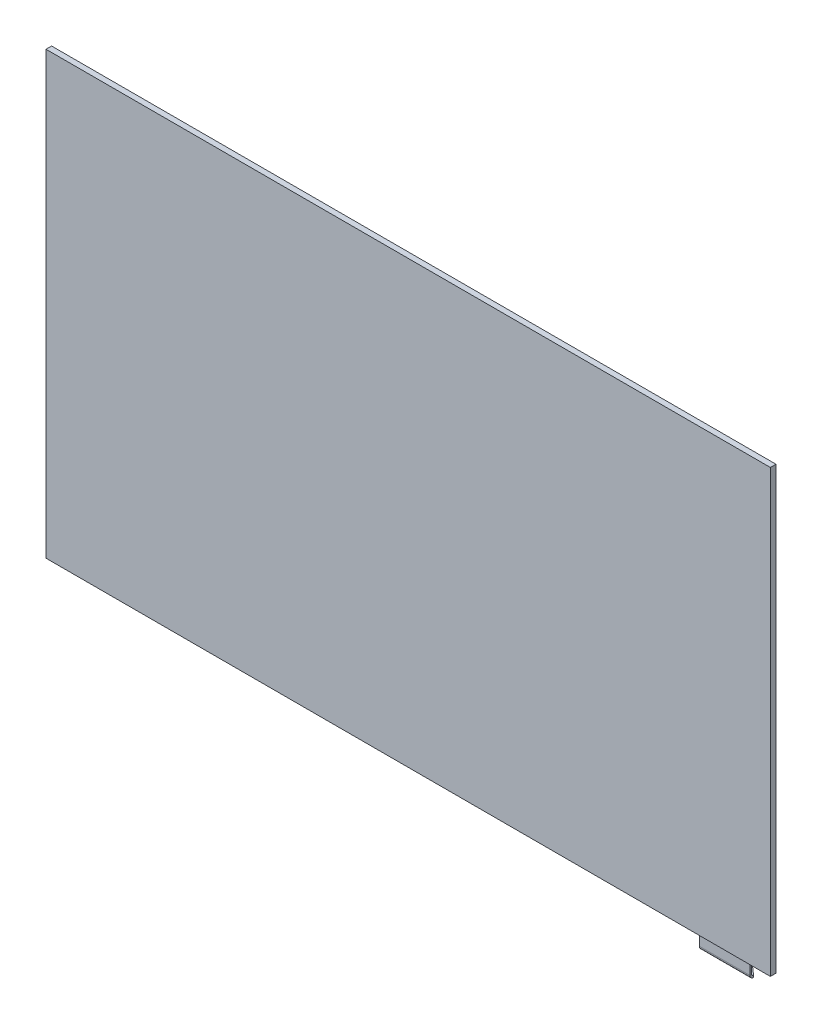
ISO-10303-21;
HEADER;
FILE_DESCRIPTION(('STEP AP214'),'2;1');
FILE_NAME('part.step','',(''),(''),'','','');
FILE_SCHEMA(('AUTOMOTIVE_DESIGN { 1 0 10303 214 1 1 1 1 }'));
ENDSEC;
DATA;
#1=APPLICATION_CONTEXT('core data for automotive mechanical design processes');
#2=APPLICATION_PROTOCOL_DEFINITION('international standard','automotive_design',2000,#1);
#3=PRODUCT_CONTEXT('',#1,'mechanical');
#4=PRODUCT('Part','Part','',(#3));
#5=PRODUCT_RELATED_PRODUCT_CATEGORY('part','',(#4));
#6=PRODUCT_DEFINITION_FORMATION('','',#4);
#7=PRODUCT_DEFINITION_CONTEXT('part definition',#1,'design');
#8=PRODUCT_DEFINITION('design','',#6,#7);
#9=PRODUCT_DEFINITION_SHAPE('','',#8);
#10=(LENGTH_UNIT() NAMED_UNIT(*) SI_UNIT(.MILLI.,.METRE.));
#11=(NAMED_UNIT(*) PLANE_ANGLE_UNIT() SI_UNIT($,.RADIAN.));
#12=(NAMED_UNIT(*) SI_UNIT($,.STERADIAN.) SOLID_ANGLE_UNIT());
#13=UNCERTAINTY_MEASURE_WITH_UNIT(LENGTH_MEASURE(1.E-05),#10,'distance_accuracy_value','');
#14=(GEOMETRIC_REPRESENTATION_CONTEXT(3) GLOBAL_UNCERTAINTY_ASSIGNED_CONTEXT((#13)) GLOBAL_UNIT_ASSIGNED_CONTEXT((#10,
#11,#12)) REPRESENTATION_CONTEXT('',''));
#15=CARTESIAN_POINT('',(0.,0.,0.));
#16=DIRECTION('',(0.,0.,1.));
#17=DIRECTION('',(1.,0.,0.));
#18=AXIS2_PLACEMENT_3D('',#15,#16,#17);
#19=CARTESIAN_POINT('',(-102.39375,-62.309375,1.5875));
#20=DIRECTION('',(0.,1.,0.));
#21=DIRECTION('',(0.,0.,1.));
#22=AXIS2_PLACEMENT_3D('',#19,#20,#21);
#23=PLANE('',#22);
#24=DIRECTION('',(1.,0.,0.));
#25=VECTOR('',#24,1.);
#26=CARTESIAN_POINT('',(-102.39375,-62.309375,0.));
#27=LINE('',#26,#25);
#28=CARTESIAN_POINT('',(-102.39375,-62.309375,0.));
#29=VERTEX_POINT('',#28);
#30=CARTESIAN_POINT('',(102.39375,-62.309375,0.));
#31=VERTEX_POINT('',#30);
#32=EDGE_CURVE('E77',#29,#31,#27,.T.);
#33=ORIENTED_EDGE('',*,*,#32,.T.);
#34=DIRECTION('',(0.,0.,-1.));
#35=VECTOR('',#34,1.);
#36=CARTESIAN_POINT('',(102.39375,-62.309375,1.5875));
#37=LINE('',#36,#35);
#38=CARTESIAN_POINT('',(102.39375,-62.309375,1.5875));
#39=VERTEX_POINT('',#38);
#40=EDGE_CURVE('E226',#39,#31,#37,.T.);
#41=ORIENTED_EDGE('',*,*,#40,.F.);
#42=DIRECTION('',(1.,0.,0.));
#43=VECTOR('',#42,1.);
#44=CARTESIAN_POINT('',(-102.39375,-62.309375,1.5875));
#45=LINE('',#44,#43);
#46=CARTESIAN_POINT('',(-102.39375,-62.309375,1.5875));
#47=VERTEX_POINT('',#46);
#48=EDGE_CURVE('E56',#47,#39,#45,.T.);
#49=ORIENTED_EDGE('',*,*,#48,.F.);
#50=DIRECTION('',(0.,0.,-1.));
#51=VECTOR('',#50,1.);
#52=CARTESIAN_POINT('',(-102.39375,-62.309375,1.5875));
#53=LINE('',#52,#51);
#54=EDGE_CURVE('E235',#47,#29,#53,.T.);
#55=ORIENTED_EDGE('',*,*,#54,.T.);
#56=EDGE_LOOP('',(#33,#41,#49,#55));
#57=FACE_BOUND('',#56,.T.);
#58=DIRECTION('',(0.,0.,-1.));
#59=VECTOR('',#58,1.);
#60=CARTESIAN_POINT('',(81.75625,-62.309375,1.04775));
#61=LINE('',#60,#59);
#62=CARTESIAN_POINT('',(81.75625,-62.309375,1.04775));
#63=VERTEX_POINT('',#62);
#64=CARTESIAN_POINT('',(81.75625,-62.309375,0.53975));
#65=VERTEX_POINT('',#64);
#66=EDGE_CURVE('E287',#63,#65,#61,.T.);
#67=ORIENTED_EDGE('',*,*,#66,.F.);
#68=DIRECTION('',(1.,0.,0.));
#69=VECTOR('',#68,1.);
#70=CARTESIAN_POINT('',(81.75625,-62.309375,1.04775));
#71=LINE('',#70,#69);
#72=CARTESIAN_POINT('',(96.04375,-62.309375,1.04775));
#73=VERTEX_POINT('',#72);
#74=EDGE_CURVE('E196',#63,#73,#71,.T.);
#75=ORIENTED_EDGE('',*,*,#74,.T.);
#76=DIRECTION('',(0.,0.,-1.));
#77=VECTOR('',#76,1.);
#78=CARTESIAN_POINT('',(96.04375,-62.309375,1.04775));
#79=LINE('',#78,#77);
#80=CARTESIAN_POINT('',(96.04375,-62.309375,0.539749999999995));
#81=VERTEX_POINT('',#80);
#82=EDGE_CURVE('E297',#73,#81,#79,.T.);
#83=ORIENTED_EDGE('',*,*,#82,.T.);
#84=DIRECTION('',(1.,0.,0.));
#85=VECTOR('',#84,1.);
#86=CARTESIAN_POINT('',(81.75625,-62.309375,0.53975));
#87=LINE('',#86,#85);
#88=EDGE_CURVE('E199',#65,#81,#87,.T.);
#89=ORIENTED_EDGE('',*,*,#88,.F.);
#90=EDGE_LOOP('',(#67,#75,#83,#89));
#91=FACE_BOUND('',#90,.T.);
#92=ADVANCED_FACE('F32',(#57,#91),#23,.F.);
#93=CARTESIAN_POINT('',(102.39375,-62.309375,1.5875));
#94=DIRECTION('',(-1.,0.,0.));
#95=DIRECTION('',(0.,0.,1.));
#96=AXIS2_PLACEMENT_3D('',#93,#94,#95);
#97=PLANE('',#96);
#98=DIRECTION('',(0.,1.,0.));
#99=VECTOR('',#98,1.);
#100=CARTESIAN_POINT('',(102.39375,-62.309375,0.));
#101=LINE('',#100,#99);
#102=CARTESIAN_POINT('',(102.39375,62.309375,0.));
#103=VERTEX_POINT('',#102);
#104=EDGE_CURVE('E189',#31,#103,#101,.T.);
#105=ORIENTED_EDGE('',*,*,#104,.T.);
#106=DIRECTION('',(0.,0.,-1.));
#107=VECTOR('',#106,1.);
#108=CARTESIAN_POINT('',(102.39375,62.309375,1.5875));
#109=LINE('',#108,#107);
#110=CARTESIAN_POINT('',(102.39375,62.309375,1.5875));
#111=VERTEX_POINT('',#110);
#112=EDGE_CURVE('E240',#111,#103,#109,.T.);
#113=ORIENTED_EDGE('',*,*,#112,.F.);
#114=DIRECTION('',(0.,1.,0.));
#115=VECTOR('',#114,1.);
#116=CARTESIAN_POINT('',(102.39375,-62.309375,1.5875));
#117=LINE('',#116,#115);
#118=EDGE_CURVE('E220',#39,#111,#117,.T.);
#119=ORIENTED_EDGE('',*,*,#118,.F.);
#120=ORIENTED_EDGE('',*,*,#40,.T.);
#121=EDGE_LOOP('',(#105,#113,#119,#120));
#122=FACE_BOUND('',#121,.T.);
#123=ADVANCED_FACE('F34',(#122),#97,.F.);
#124=CARTESIAN_POINT('',(-102.39375,62.309375,1.5875));
#125=DIRECTION('',(0.,-1.,0.));
#126=DIRECTION('',(0.,0.,-1.));
#127=AXIS2_PLACEMENT_3D('',#124,#125,#126);
#128=PLANE('',#127);
#129=DIRECTION('',(-1.,0.,0.));
#130=VECTOR('',#129,1.);
#131=CARTESIAN_POINT('',(-102.39375,62.309375,0.));
#132=LINE('',#131,#130);
#133=CARTESIAN_POINT('',(-102.39375,62.309375,0.));
#134=VERTEX_POINT('',#133);
#135=EDGE_CURVE('E229',#103,#134,#132,.T.);
#136=ORIENTED_EDGE('',*,*,#135,.T.);
#137=DIRECTION('',(0.,0.,-1.));
#138=VECTOR('',#137,1.);
#139=CARTESIAN_POINT('',(-102.39375,62.309375,1.5875));
#140=LINE('',#139,#138);
#141=CARTESIAN_POINT('',(-102.39375,62.309375,1.5875));
#142=VERTEX_POINT('',#141);
#143=EDGE_CURVE('E237',#142,#134,#140,.T.);
#144=ORIENTED_EDGE('',*,*,#143,.F.);
#145=DIRECTION('',(-1.,0.,0.));
#146=VECTOR('',#145,1.);
#147=CARTESIAN_POINT('',(-102.39375,62.309375,1.5875));
#148=LINE('',#147,#146);
#149=EDGE_CURVE('E85',#111,#142,#148,.T.);
#150=ORIENTED_EDGE('',*,*,#149,.F.);
#151=ORIENTED_EDGE('',*,*,#112,.T.);
#152=EDGE_LOOP('',(#136,#144,#150,#151));
#153=FACE_BOUND('',#152,.T.);
#154=ADVANCED_FACE('F347',(#153),#128,.F.);
#155=CARTESIAN_POINT('',(-102.39375,-62.309375,1.5875));
#156=DIRECTION('',(1.,0.,0.));
#157=DIRECTION('',(0.,0.,-1.));
#158=AXIS2_PLACEMENT_3D('',#155,#156,#157);
#159=PLANE('',#158);
#160=DIRECTION('',(0.,-1.,0.));
#161=VECTOR('',#160,1.);
#162=CARTESIAN_POINT('',(-102.39375,-62.309375,0.));
#163=LINE('',#162,#161);
#164=EDGE_CURVE('E231',#134,#29,#163,.T.);
#165=ORIENTED_EDGE('',*,*,#164,.T.);
#166=ORIENTED_EDGE('',*,*,#54,.F.);
#167=DIRECTION('',(0.,-1.,0.));
#168=VECTOR('',#167,1.);
#169=CARTESIAN_POINT('',(-102.39375,-62.309375,1.5875));
#170=LINE('',#169,#168);
#171=EDGE_CURVE('E223',#142,#47,#170,.T.);
#172=ORIENTED_EDGE('',*,*,#171,.F.);
#173=ORIENTED_EDGE('',*,*,#143,.T.);
#174=EDGE_LOOP('',(#165,#166,#172,#173));
#175=FACE_BOUND('',#174,.T.);
#176=ADVANCED_FACE('F353',(#175),#159,.F.);
#177=CARTESIAN_POINT('',(102.39375,62.309375,1.5875));
#178=DIRECTION('',(0.,0.,-1.));
#179=DIRECTION('',(-1.,0.,0.));
#180=AXIS2_PLACEMENT_3D('',#177,#178,#179);
#181=PLANE('',#180);
#182=ORIENTED_EDGE('',*,*,#118,.T.);
#183=ORIENTED_EDGE('',*,*,#149,.T.);
#184=ORIENTED_EDGE('',*,*,#171,.T.);
#185=ORIENTED_EDGE('',*,*,#48,.T.);
#186=EDGE_LOOP('',(#182,#183,#184,#185));
#187=FACE_BOUND('',#186,.T.);
#188=ADVANCED_FACE('F355',(#187),#181,.F.);
#189=CARTESIAN_POINT('',(102.39375,62.309375,0.));
#190=DIRECTION('',(0.,0.,-1.));
#191=DIRECTION('',(-1.,0.,0.));
#192=AXIS2_PLACEMENT_3D('',#189,#190,#191);
#193=PLANE('',#192);
#194=ORIENTED_EDGE('',*,*,#104,.F.);
#195=ORIENTED_EDGE('',*,*,#32,.F.);
#196=ORIENTED_EDGE('',*,*,#164,.F.);
#197=ORIENTED_EDGE('',*,*,#135,.F.);
#198=EDGE_LOOP('',(#194,#195,#196,#197));
#199=FACE_BOUND('',#198,.T.);
#200=ADVANCED_FACE('F351',(#199),#193,.T.);
#201=CARTESIAN_POINT('',(81.75625,-65.484375,-5.2705));
#202=DIRECTION('',(0.,0.,-1.));
#203=DIRECTION('',(-1.,0.,0.));
#204=AXIS2_PLACEMENT_3D('',#201,#202,#203);
#205=PLANE('',#204);
#206=DIRECTION('',(0.,-1.,0.));
#207=VECTOR('',#206,1.);
#208=CARTESIAN_POINT('',(91.28125,62.309375,-5.27050000000056));
#209=LINE('',#208,#207);
#210=CARTESIAN_POINT('',(91.28125,-27.384375,-5.27050000000017));
#211=VERTEX_POINT('',#210);
#212=CARTESIAN_POINT('',(91.28125,-65.484375,-5.2705));
#213=VERTEX_POINT('',#212);
#214=EDGE_CURVE('E164',#211,#213,#209,.T.);
#215=ORIENTED_EDGE('',*,*,#214,.T.);
#216=DIRECTION('',(1.,0.,0.));
#217=VECTOR('',#216,1.);
#218=CARTESIAN_POINT('',(81.75625,-65.484375,-5.2705));
#219=LINE('',#218,#217);
#220=CARTESIAN_POINT('',(86.51875,-65.484375,-5.2705));
#221=VERTEX_POINT('',#220);
#222=EDGE_CURVE('E182',#221,#213,#219,.T.);
#223=ORIENTED_EDGE('',*,*,#222,.F.);
#224=DIRECTION('',(0.,-1.,0.));
#225=VECTOR('',#224,1.);
#226=CARTESIAN_POINT('',(86.51875,62.309375,-5.27050000000056));
#227=LINE('',#226,#225);
#228=CARTESIAN_POINT('',(86.51875,-27.384375,-5.27050000000017));
#229=VERTEX_POINT('',#228);
#230=EDGE_CURVE('E266',#229,#221,#227,.T.);
#231=ORIENTED_EDGE('',*,*,#230,.F.);
#232=DIRECTION('',(1.,0.,0.));
#233=VECTOR('',#232,1.);
#234=CARTESIAN_POINT('',(81.75625,-27.384375,-5.2705));
#235=LINE('',#234,#233);
#236=EDGE_CURVE('E216',#229,#211,#235,.T.);
#237=ORIENTED_EDGE('',*,*,#236,.T.);
#238=EDGE_LOOP('',(#215,#223,#231,#237));
#239=FACE_BOUND('',#238,.T.);
#240=ADVANCED_FACE('F371',(#239),#205,.T.);
#241=CARTESIAN_POINT('',(81.75625,-65.484375,-4.22275));
#242=DIRECTION('',(1.,0.,0.));
#243=DIRECTION('',(0.,0.,-1.));
#244=AXIS2_PLACEMENT_3D('',#241,#242,#243);
#245=CYLINDRICAL_SURFACE('',#244,1.04775);
#246=CARTESIAN_POINT('',(91.28125,-65.484375,-4.22275));
#247=DIRECTION('',(-1.,0.,0.));
#248=DIRECTION('',(0.,0.,1.));
#249=AXIS2_PLACEMENT_3D('',#246,#247,#248);
#250=CIRCLE('',#249,1.04775);
#251=CARTESIAN_POINT('',(91.28125,-66.532125,-4.22275));
#252=VERTEX_POINT('',#251);
#253=EDGE_CURVE('E158',#252,#213,#250,.F.);
#254=ORIENTED_EDGE('',*,*,#253,.F.);
#255=DIRECTION('',(1.,0.,0.));
#256=VECTOR('',#255,1.);
#257=CARTESIAN_POINT('',(81.75625,-66.532125,-4.22275));
#258=LINE('',#257,#256);
#259=CARTESIAN_POINT('',(86.51875,-66.532125,-4.22275));
#260=VERTEX_POINT('',#259);
#261=EDGE_CURVE('E180',#260,#252,#258,.T.);
#262=ORIENTED_EDGE('',*,*,#261,.F.);
#263=CARTESIAN_POINT('',(86.51875,-65.484375,-4.22275));
#264=DIRECTION('',(1.,0.,0.));
#265=DIRECTION('',(0.,0.,-1.));
#266=AXIS2_PLACEMENT_3D('',#263,#264,#265);
#267=CIRCLE('',#266,1.04775);
#268=EDGE_CURVE('E278',#221,#260,#267,.F.);
#269=ORIENTED_EDGE('',*,*,#268,.F.);
#270=ORIENTED_EDGE('',*,*,#222,.T.);
#271=EDGE_LOOP('',(#254,#262,#269,#270));
#272=FACE_BOUND('',#271,.T.);
#273=ADVANCED_FACE('F178',(#272),#245,.T.);
#274=CARTESIAN_POINT('',(81.75625,-66.532125,0.));
#275=DIRECTION('',(0.,-1.,0.));
#276=DIRECTION('',(0.,0.,-1.));
#277=AXIS2_PLACEMENT_3D('',#274,#275,#276);
#278=PLANE('',#277);
#279=DIRECTION('',(-0.748234379459937,0.,-0.663434483121132));
#280=VECTOR('',#279,1.);
#281=CARTESIAN_POINT('',(96.04375,-66.532125,0.));
#282=LINE('',#281,#280);
#283=CARTESIAN_POINT('',(96.04375,-66.532125,0.));
#284=VERTEX_POINT('',#283);
#285=EDGE_CURVE('E165',#284,#252,#282,.T.);
#286=ORIENTED_EDGE('',*,*,#285,.F.);
#287=DIRECTION('',(1.,0.,0.));
#288=VECTOR('',#287,1.);
#289=CARTESIAN_POINT('',(81.75625,-66.532125,0.));
#290=LINE('',#289,#288);
#291=CARTESIAN_POINT('',(81.75625,-66.532125,0.));
#292=VERTEX_POINT('',#291);
#293=EDGE_CURVE('E187',#292,#284,#290,.T.);
#294=ORIENTED_EDGE('',*,*,#293,.F.);
#295=DIRECTION('',(-0.748234379459937,0.,0.663434483121132));
#296=VECTOR('',#295,1.);
#297=CARTESIAN_POINT('',(81.75625,-66.532125,0.));
#298=LINE('',#297,#296);
#299=EDGE_CURVE('E183',#260,#292,#298,.T.);
#300=ORIENTED_EDGE('',*,*,#299,.F.);
#301=ORIENTED_EDGE('',*,*,#261,.T.);
#302=EDGE_LOOP('',(#286,#294,#300,#301));
#303=FACE_BOUND('',#302,.T.);
#304=ADVANCED_FACE('F186',(#303),#278,.T.);
#305=CARTESIAN_POINT('',(81.75625,-65.484375,0.));
#306=DIRECTION('',(1.,0.,0.));
#307=DIRECTION('',(0.,0.,-1.));
#308=AXIS2_PLACEMENT_3D('',#305,#306,#307);
#309=CYLINDRICAL_SURFACE('',#308,1.04775000000001);
#310=CARTESIAN_POINT('',(96.04375,-65.484375,0.));
#311=DIRECTION('',(1.,0.,0.));
#312=DIRECTION('',(0.,0.,-1.));
#313=AXIS2_PLACEMENT_3D('',#310,#311,#312);
#314=CIRCLE('',#313,1.04775000000001);
#315=CARTESIAN_POINT('',(96.04375,-65.484375,1.04774999999999));
#316=VERTEX_POINT('',#315);
#317=EDGE_CURVE('E285',#316,#284,#314,.T.);
#318=ORIENTED_EDGE('',*,*,#317,.F.);
#319=DIRECTION('',(1.,0.,0.));
#320=VECTOR('',#319,1.);
#321=CARTESIAN_POINT('',(81.75625,-65.484375,1.04774999999999));
#322=LINE('',#321,#320);
#323=CARTESIAN_POINT('',(81.75625,-65.484375,1.04774999999999));
#324=VERTEX_POINT('',#323);
#325=EDGE_CURVE('E191',#324,#316,#322,.T.);
#326=ORIENTED_EDGE('',*,*,#325,.F.);
#327=CARTESIAN_POINT('',(81.75625,-65.484375,0.));
#328=DIRECTION('',(1.,0.,0.));
#329=DIRECTION('',(0.,0.,-1.));
#330=AXIS2_PLACEMENT_3D('',#327,#328,#329);
#331=CIRCLE('',#330,1.04775000000001);
#332=EDGE_CURVE('E219',#324,#292,#331,.T.);
#333=ORIENTED_EDGE('',*,*,#332,.T.);
#334=ORIENTED_EDGE('',*,*,#293,.T.);
#335=EDGE_LOOP('',(#318,#326,#333,#334));
#336=FACE_BOUND('',#335,.T.);
#337=ADVANCED_FACE('F307',(#336),#309,.T.);
#338=CARTESIAN_POINT('',(81.75625,-62.309375,1.04775));
#339=DIRECTION('',(0.,0.,1.));
#340=DIRECTION('',(0.,-1.,0.));
#341=AXIS2_PLACEMENT_3D('',#338,#339,#340);
#342=PLANE('',#341);
#343=DIRECTION('',(0.,-1.,0.));
#344=VECTOR('',#343,1.);
#345=CARTESIAN_POINT('',(96.04375,-62.309375,1.04775));
#346=LINE('',#345,#344);
#347=EDGE_CURVE('E300',#73,#316,#346,.T.);
#348=ORIENTED_EDGE('',*,*,#347,.F.);
#349=ORIENTED_EDGE('',*,*,#74,.F.);
#350=DIRECTION('',(0.,-1.,0.));
#351=VECTOR('',#350,1.);
#352=CARTESIAN_POINT('',(81.75625,-62.309375,1.04775));
#353=LINE('',#352,#351);
#354=EDGE_CURVE('E289',#63,#324,#353,.T.);
#355=ORIENTED_EDGE('',*,*,#354,.T.);
#356=ORIENTED_EDGE('',*,*,#325,.T.);
#357=EDGE_LOOP('',(#348,#349,#355,#356));
#358=FACE_BOUND('',#357,.T.);
#359=ADVANCED_FACE('F314',(#358),#342,.T.);
#360=CARTESIAN_POINT('',(81.75625,-62.309375,0.53975));
#361=DIRECTION('',(0.,0.,1.));
#362=DIRECTION('',(0.,-1.,0.));
#363=AXIS2_PLACEMENT_3D('',#360,#361,#362);
#364=PLANE('',#363);
#365=DIRECTION('',(0.,-1.,0.));
#366=VECTOR('',#365,1.);
#367=CARTESIAN_POINT('',(96.04375,-62.309375,0.53975));
#368=LINE('',#367,#366);
#369=CARTESIAN_POINT('',(96.04375,-65.484375,0.539749999999989));
#370=VERTEX_POINT('',#369);
#371=EDGE_CURVE('E47',#81,#370,#368,.T.);
#372=ORIENTED_EDGE('',*,*,#371,.T.);
#373=DIRECTION('',(1.,0.,0.));
#374=VECTOR('',#373,1.);
#375=CARTESIAN_POINT('',(81.75625,-65.484375,0.539749999999989));
#376=LINE('',#375,#374);
#377=CARTESIAN_POINT('',(81.75625,-65.484375,0.539749999999989));
#378=VERTEX_POINT('',#377);
#379=EDGE_CURVE('E201',#378,#370,#376,.T.);
#380=ORIENTED_EDGE('',*,*,#379,.F.);
#381=DIRECTION('',(0.,-1.,0.));
#382=VECTOR('',#381,1.);
#383=CARTESIAN_POINT('',(81.75625,-62.309375,0.53975));
#384=LINE('',#383,#382);
#385=EDGE_CURVE('E284',#65,#378,#384,.T.);
#386=ORIENTED_EDGE('',*,*,#385,.F.);
#387=ORIENTED_EDGE('',*,*,#88,.T.);
#388=EDGE_LOOP('',(#372,#380,#386,#387));
#389=FACE_BOUND('',#388,.T.);
#390=ADVANCED_FACE('F320',(#389),#364,.F.);
#391=CARTESIAN_POINT('',(81.75625,-65.484375,0.));
#392=DIRECTION('',(1.,0.,0.));
#393=DIRECTION('',(0.,0.,-1.));
#394=AXIS2_PLACEMENT_3D('',#391,#392,#393);
#395=CYLINDRICAL_SURFACE('',#394,0.539750000000006);
#396=CARTESIAN_POINT('',(96.04375,-65.484375,0.));
#397=DIRECTION('',(1.,0.,0.));
#398=DIRECTION('',(0.,0.,-1.));
#399=AXIS2_PLACEMENT_3D('',#396,#397,#398);
#400=CIRCLE('',#399,0.539750000000006);
#401=CARTESIAN_POINT('',(96.04375,-66.024125,0.));
#402=VERTEX_POINT('',#401);
#403=EDGE_CURVE('E280',#370,#402,#400,.T.);
#404=ORIENTED_EDGE('',*,*,#403,.T.);
#405=DIRECTION('',(1.,0.,0.));
#406=VECTOR('',#405,1.);
#407=CARTESIAN_POINT('',(81.75625,-66.024125,0.));
#408=LINE('',#407,#406);
#409=CARTESIAN_POINT('',(81.75625,-66.024125,0.));
#410=VERTEX_POINT('',#409);
#411=EDGE_CURVE('E204',#410,#402,#408,.T.);
#412=ORIENTED_EDGE('',*,*,#411,.F.);
#413=CARTESIAN_POINT('',(81.75625,-65.484375,0.));
#414=DIRECTION('',(1.,0.,0.));
#415=DIRECTION('',(0.,0.,-1.));
#416=AXIS2_PLACEMENT_3D('',#413,#414,#415);
#417=CIRCLE('',#416,0.539750000000006);
#418=EDGE_CURVE('E281',#378,#410,#417,.T.);
#419=ORIENTED_EDGE('',*,*,#418,.F.);
#420=ORIENTED_EDGE('',*,*,#379,.T.);
#421=EDGE_LOOP('',(#404,#412,#419,#420));
#422=FACE_BOUND('',#421,.T.);
#423=ADVANCED_FACE('F324',(#422),#395,.F.);
#424=CARTESIAN_POINT('',(81.75625,-66.024125,0.));
#425=DIRECTION('',(0.,-1.,0.));
#426=DIRECTION('',(0.,0.,-1.));
#427=AXIS2_PLACEMENT_3D('',#424,#425,#426);
#428=PLANE('',#427);
#429=ORIENTED_EDGE('',*,*,#411,.T.);
#430=DIRECTION('',(-0.748234379459937,0.,-0.663434483121132));
#431=VECTOR('',#430,1.);
#432=CARTESIAN_POINT('',(88.0448261651197,-66.024125,-7.0923791335938));
#433=LINE('',#432,#431);
#434=CARTESIAN_POINT('',(91.28125,-66.024125,-4.22275));
#435=VERTEX_POINT('',#434);
#436=EDGE_CURVE('E260',#402,#435,#433,.T.);
#437=ORIENTED_EDGE('',*,*,#436,.T.);
#438=DIRECTION('',(1.,0.,0.));
#439=VECTOR('',#438,1.);
#440=CARTESIAN_POINT('',(81.75625,-66.024125,-4.22275));
#441=LINE('',#440,#439);
#442=CARTESIAN_POINT('',(86.51875,-66.024125,-4.22275));
#443=VERTEX_POINT('',#442);
#444=EDGE_CURVE('E207',#443,#435,#441,.T.);
#445=ORIENTED_EDGE('',*,*,#444,.F.);
#446=DIRECTION('',(-0.748234379459937,0.,0.663434483121132));
#447=VECTOR('',#446,1.);
#448=CARTESIAN_POINT('',(81.75625,-66.024125,0.));
#449=LINE('',#448,#447);
#450=EDGE_CURVE('E270',#443,#410,#449,.T.);
#451=ORIENTED_EDGE('',*,*,#450,.T.);
#452=EDGE_LOOP('',(#429,#437,#445,#451));
#453=FACE_BOUND('',#452,.T.);
#454=ADVANCED_FACE('F326',(#453),#428,.F.);
#455=CARTESIAN_POINT('',(81.75625,-65.484375,-4.22275));
#456=DIRECTION('',(1.,0.,0.));
#457=DIRECTION('',(0.,0.,-1.));
#458=AXIS2_PLACEMENT_3D('',#455,#456,#457);
#459=CYLINDRICAL_SURFACE('',#458,0.539750000000005);
#460=ORIENTED_EDGE('',*,*,#444,.T.);
#461=CARTESIAN_POINT('',(91.28125,-65.484375,-4.22275));
#462=DIRECTION('',(-1.,0.,0.));
#463=DIRECTION('',(0.,0.,1.));
#464=AXIS2_PLACEMENT_3D('',#461,#462,#463);
#465=CIRCLE('',#464,0.539750000000005);
#466=CARTESIAN_POINT('',(91.28125,-65.484375,-4.7625));
#467=VERTEX_POINT('',#466);
#468=EDGE_CURVE('E161',#435,#467,#465,.F.);
#469=ORIENTED_EDGE('',*,*,#468,.T.);
#470=DIRECTION('',(1.,0.,0.));
#471=VECTOR('',#470,1.);
#472=CARTESIAN_POINT('',(81.75625,-65.484375,-4.7625));
#473=LINE('',#472,#471);
#474=CARTESIAN_POINT('',(86.51875,-65.484375,-4.7625));
#475=VERTEX_POINT('',#474);
#476=EDGE_CURVE('E210',#475,#467,#473,.T.);
#477=ORIENTED_EDGE('',*,*,#476,.F.);
#478=CARTESIAN_POINT('',(86.51875,-65.484375,-4.22275));
#479=DIRECTION('',(1.,0.,0.));
#480=DIRECTION('',(0.,0.,-1.));
#481=AXIS2_PLACEMENT_3D('',#478,#479,#480);
#482=CIRCLE('',#481,0.539750000000005);
#483=EDGE_CURVE('E275',#475,#443,#482,.F.);
#484=ORIENTED_EDGE('',*,*,#483,.T.);
#485=EDGE_LOOP('',(#460,#469,#477,#484));
#486=FACE_BOUND('',#485,.T.);
#487=ADVANCED_FACE('F333',(#486),#459,.F.);
#488=CARTESIAN_POINT('',(81.75625,-65.484375,-4.7625));
#489=DIRECTION('',(0.,0.,-1.));
#490=DIRECTION('',(-1.,0.,0.));
#491=AXIS2_PLACEMENT_3D('',#488,#489,#490);
#492=PLANE('',#491);
#493=ORIENTED_EDGE('',*,*,#476,.T.);
#494=DIRECTION('',(0.,1.,0.));
#495=VECTOR('',#494,1.);
#496=CARTESIAN_POINT('',(91.28125,-65.484375,-4.7625));
#497=LINE('',#496,#495);
#498=CARTESIAN_POINT('',(91.28125,-27.384375,-4.7625));
#499=VERTEX_POINT('',#498);
#500=EDGE_CURVE('E259',#467,#499,#497,.T.);
#501=ORIENTED_EDGE('',*,*,#500,.T.);
#502=DIRECTION('',(1.,0.,0.));
#503=VECTOR('',#502,1.);
#504=CARTESIAN_POINT('',(81.75625,-27.384375,-4.7625));
#505=LINE('',#504,#503);
#506=CARTESIAN_POINT('',(86.51875,-27.384375,-4.7625));
#507=VERTEX_POINT('',#506);
#508=EDGE_CURVE('E213',#507,#499,#505,.T.);
#509=ORIENTED_EDGE('',*,*,#508,.F.);
#510=DIRECTION('',(0.,-1.,0.));
#511=VECTOR('',#510,1.);
#512=CARTESIAN_POINT('',(86.51875,-65.484375,-4.7625));
#513=LINE('',#512,#511);
#514=EDGE_CURVE('E257',#507,#475,#513,.T.);
#515=ORIENTED_EDGE('',*,*,#514,.T.);
#516=EDGE_LOOP('',(#493,#501,#509,#515));
#517=FACE_BOUND('',#516,.T.);
#518=ADVANCED_FACE('F256',(#517),#492,.F.);
#519=CARTESIAN_POINT('',(81.75625,-27.384375,-4.7625));
#520=DIRECTION('',(0.,-1.,0.));
#521=DIRECTION('',(0.,0.,-1.));
#522=AXIS2_PLACEMENT_3D('',#519,#520,#521);
#523=PLANE('',#522);
#524=ORIENTED_EDGE('',*,*,#508,.T.);
#525=DIRECTION('',(0.,0.,-1.));
#526=VECTOR('',#525,1.);
#527=CARTESIAN_POINT('',(91.28125,-27.384375,-4.7625));
#528=LINE('',#527,#526);
#529=EDGE_CURVE('E11',#499,#211,#528,.T.);
#530=ORIENTED_EDGE('',*,*,#529,.T.);
#531=ORIENTED_EDGE('',*,*,#236,.F.);
#532=DIRECTION('',(0.,0.,1.));
#533=VECTOR('',#532,1.);
#534=CARTESIAN_POINT('',(86.51875,-27.384375,-4.7625));
#535=LINE('',#534,#533);
#536=EDGE_CURVE('E245',#229,#507,#535,.T.);
#537=ORIENTED_EDGE('',*,*,#536,.T.);
#538=EDGE_LOOP('',(#524,#530,#531,#537));
#539=FACE_BOUND('',#538,.T.);
#540=ADVANCED_FACE('F250',(#539),#523,.F.);
#541=CARTESIAN_POINT('',(81.75625,-65.484375,-4.22275));
#542=DIRECTION('',(1.,0.,0.));
#543=DIRECTION('',(0.,0.,-1.));
#544=AXIS2_PLACEMENT_3D('',#541,#542,#543);
#545=PLANE('',#544);
#546=ORIENTED_EDGE('',*,*,#418,.T.);
#547=DIRECTION('',(0.,-1.,0.));
#548=VECTOR('',#547,1.);
#549=CARTESIAN_POINT('',(81.75625,-65.484375,0.));
#550=LINE('',#549,#548);
#551=EDGE_CURVE('E242',#410,#292,#550,.T.);
#552=ORIENTED_EDGE('',*,*,#551,.T.);
#553=ORIENTED_EDGE('',*,*,#332,.F.);
#554=ORIENTED_EDGE('',*,*,#354,.F.);
#555=ORIENTED_EDGE('',*,*,#66,.T.);
#556=ORIENTED_EDGE('',*,*,#385,.T.);
#557=EDGE_LOOP('',(#546,#552,#553,#554,#555,#556));
#558=FACE_BOUND('',#557,.T.);
#559=ADVANCED_FACE('F311',(#558),#545,.F.);
#560=CARTESIAN_POINT('',(96.04375,-65.484375,-4.22275));
#561=DIRECTION('',(1.,0.,0.));
#562=DIRECTION('',(0.,0.,-1.));
#563=AXIS2_PLACEMENT_3D('',#560,#561,#562);
#564=PLANE('',#563);
#565=DIRECTION('',(0.,-1.,0.));
#566=VECTOR('',#565,1.);
#567=CARTESIAN_POINT('',(96.04375,-65.484375,0.));
#568=LINE('',#567,#566);
#569=EDGE_CURVE('E40',#402,#284,#568,.T.);
#570=ORIENTED_EDGE('',*,*,#569,.F.);
#571=ORIENTED_EDGE('',*,*,#403,.F.);
#572=ORIENTED_EDGE('',*,*,#371,.F.);
#573=ORIENTED_EDGE('',*,*,#82,.F.);
#574=ORIENTED_EDGE('',*,*,#347,.T.);
#575=ORIENTED_EDGE('',*,*,#317,.T.);
#576=EDGE_LOOP('',(#570,#571,#572,#573,#574,#575));
#577=FACE_BOUND('',#576,.T.);
#578=ADVANCED_FACE('F304',(#577),#564,.T.);
#579=CARTESIAN_POINT('',(86.51875,62.309375,-4.22275000000056));
#580=DIRECTION('',(1.,0.,0.));
#581=DIRECTION('',(0.,0.,-1.));
#582=AXIS2_PLACEMENT_3D('',#579,#580,#581);
#583=PLANE('',#582);
#584=ORIENTED_EDGE('',*,*,#268,.T.);
#585=DIRECTION('',(0.,-1.,0.));
#586=VECTOR('',#585,1.);
#587=CARTESIAN_POINT('',(86.51875,62.309375,-4.22275000000056));
#588=LINE('',#587,#586);
#589=EDGE_CURVE('E267',#443,#260,#588,.T.);
#590=ORIENTED_EDGE('',*,*,#589,.F.);
#591=ORIENTED_EDGE('',*,*,#483,.F.);
#592=ORIENTED_EDGE('',*,*,#514,.F.);
#593=ORIENTED_EDGE('',*,*,#536,.F.);
#594=ORIENTED_EDGE('',*,*,#230,.T.);
#595=EDGE_LOOP('',(#584,#590,#591,#592,#593,#594));
#596=FACE_BOUND('',#595,.T.);
#597=ADVANCED_FACE('F331',(#596),#583,.F.);
#598=CARTESIAN_POINT('',(81.75625,62.309375,-6.50540097066496E-13));
#599=DIRECTION('',(0.663434483121132,0.,0.748234379459937));
#600=DIRECTION('',(0.748234379459937,0.,-0.663434483121132));
#601=AXIS2_PLACEMENT_3D('',#598,#599,#600);
#602=PLANE('',#601);
#603=ORIENTED_EDGE('',*,*,#589,.T.);
#604=ORIENTED_EDGE('',*,*,#299,.T.);
#605=ORIENTED_EDGE('',*,*,#551,.F.);
#606=ORIENTED_EDGE('',*,*,#450,.F.);
#607=EDGE_LOOP('',(#603,#604,#605,#606));
#608=FACE_BOUND('',#607,.T.);
#609=ADVANCED_FACE('F330',(#608),#602,.F.);
#610=CARTESIAN_POINT('',(91.28125,62.309375,-4.22275000000056));
#611=DIRECTION('',(-1.,0.,0.));
#612=DIRECTION('',(0.,0.,1.));
#613=AXIS2_PLACEMENT_3D('',#610,#611,#612);
#614=PLANE('',#613);
#615=ORIENTED_EDGE('',*,*,#253,.T.);
#616=ORIENTED_EDGE('',*,*,#214,.F.);
#617=ORIENTED_EDGE('',*,*,#529,.F.);
#618=ORIENTED_EDGE('',*,*,#500,.F.);
#619=ORIENTED_EDGE('',*,*,#468,.F.);
#620=DIRECTION('',(0.,-1.,0.));
#621=VECTOR('',#620,1.);
#622=CARTESIAN_POINT('',(91.28125,62.309375,-4.22275000000056));
#623=LINE('',#622,#621);
#624=EDGE_CURVE('E154',#435,#252,#623,.T.);
#625=ORIENTED_EDGE('',*,*,#624,.T.);
#626=EDGE_LOOP('',(#615,#616,#617,#618,#619,#625));
#627=FACE_BOUND('',#626,.T.);
#628=ADVANCED_FACE('F156',(#627),#614,.F.);
#629=CARTESIAN_POINT('',(96.04375,62.309375,-6.50540097066496E-13));
#630=DIRECTION('',(-0.663434483121132,0.,0.748234379459937));
#631=DIRECTION('',(0.748234379459937,0.,0.663434483121132));
#632=AXIS2_PLACEMENT_3D('',#629,#630,#631);
#633=PLANE('',#632);
#634=ORIENTED_EDGE('',*,*,#569,.T.);
#635=ORIENTED_EDGE('',*,*,#285,.T.);
#636=ORIENTED_EDGE('',*,*,#624,.F.);
#637=ORIENTED_EDGE('',*,*,#436,.F.);
#638=EDGE_LOOP('',(#634,#635,#636,#637));
#639=FACE_BOUND('',#638,.T.);
#640=ADVANCED_FACE('F168',(#639),#633,.F.);
#641=CLOSED_SHELL('',(#92,#123,#154,#176,#188,#200,#240,#273,#304,#337,#359,#390,#423,#454,#487,
#518,#540,#559,#578,#597,#609,#628,#640));
#642=MANIFOLD_SOLID_BREP('B2',#641);
#643=ADVANCED_BREP_SHAPE_REPRESENTATION('',(#18,#642),#14);
#644=SHAPE_DEFINITION_REPRESENTATION(#9,#643);
ENDSEC;
END-ISO-10303-21;
